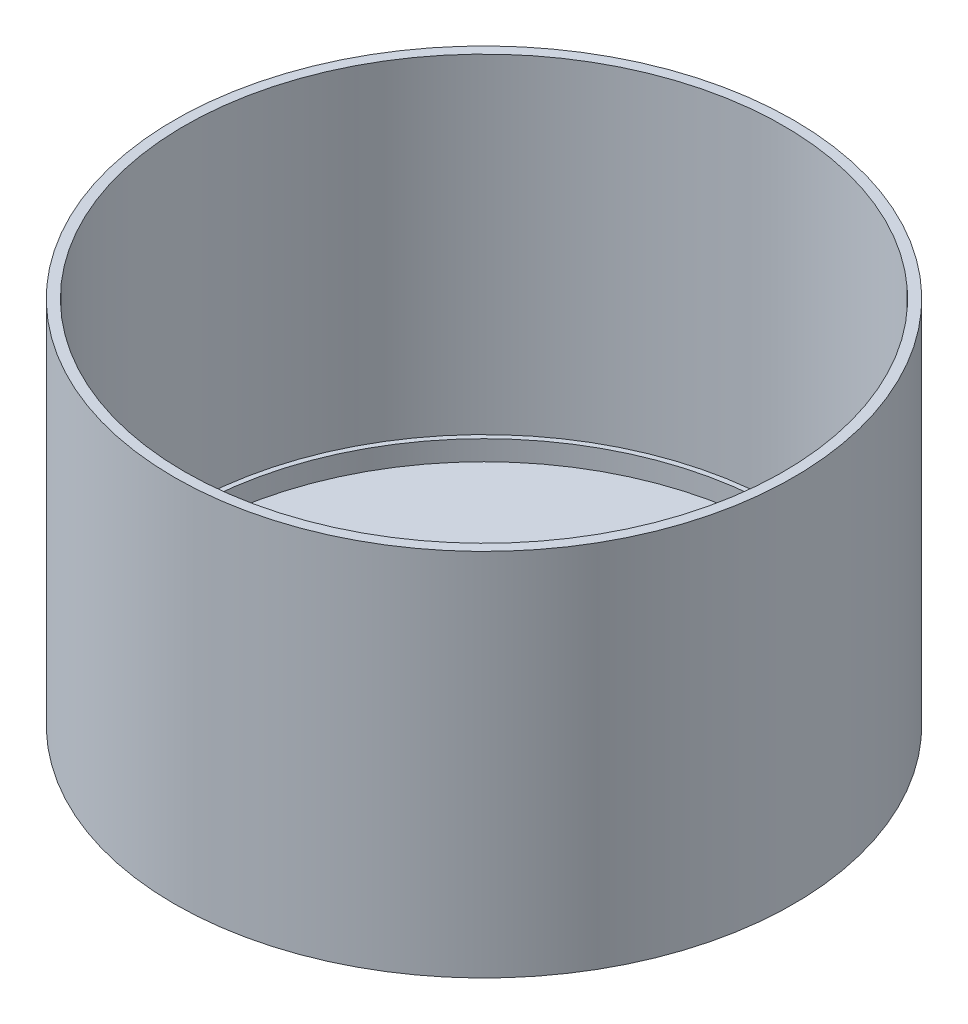
ISO-10303-21;
HEADER;
FILE_DESCRIPTION(('STEP AP214'),'2;1');
FILE_NAME('part.step','',(''),(''),'','','');
FILE_SCHEMA(('AUTOMOTIVE_DESIGN { 1 0 10303 214 1 1 1 1 }'));
ENDSEC;
DATA;
#1=APPLICATION_CONTEXT('core data for automotive mechanical design processes');
#2=APPLICATION_PROTOCOL_DEFINITION('international standard','automotive_design',2000,#1);
#3=PRODUCT_CONTEXT('',#1,'mechanical');
#4=PRODUCT('Part','Part','',(#3));
#5=PRODUCT_RELATED_PRODUCT_CATEGORY('part','',(#4));
#6=PRODUCT_DEFINITION_FORMATION('','',#4);
#7=PRODUCT_DEFINITION_CONTEXT('part definition',#1,'design');
#8=PRODUCT_DEFINITION('design','',#6,#7);
#9=PRODUCT_DEFINITION_SHAPE('','',#8);
#10=(LENGTH_UNIT() NAMED_UNIT(*) SI_UNIT(.MILLI.,.METRE.));
#11=(NAMED_UNIT(*) PLANE_ANGLE_UNIT() SI_UNIT($,.RADIAN.));
#12=(NAMED_UNIT(*) SI_UNIT($,.STERADIAN.) SOLID_ANGLE_UNIT());
#13=UNCERTAINTY_MEASURE_WITH_UNIT(LENGTH_MEASURE(1.E-05),#10,'distance_accuracy_value','');
#14=(GEOMETRIC_REPRESENTATION_CONTEXT(3) GLOBAL_UNCERTAINTY_ASSIGNED_CONTEXT((#13)) GLOBAL_UNIT_ASSIGNED_CONTEXT((#10,
#11,#12)) REPRESENTATION_CONTEXT('',''));
#15=CARTESIAN_POINT('',(0.,0.,0.));
#16=DIRECTION('',(0.,0.,1.));
#17=DIRECTION('',(1.,0.,0.));
#18=AXIS2_PLACEMENT_3D('',#15,#16,#17);
#19=CARTESIAN_POINT('',(0.,37.,0.));
#20=DIRECTION('',(0.,1.,0.));
#21=DIRECTION('',(0.,0.,1.));
#22=AXIS2_PLACEMENT_3D('',#19,#20,#21);
#23=PLANE('',#22);
#24=CARTESIAN_POINT('',(0.,37.,0.));
#25=DIRECTION('',(0.,1.,0.));
#26=DIRECTION('',(0.,0.,1.));
#27=AXIS2_PLACEMENT_3D('',#24,#25,#26);
#28=CIRCLE('',#27,31.);
#29=CARTESIAN_POINT('',(0.,37.,31.));
#30=VERTEX_POINT('',#29);
#31=EDGE_CURVE('E48',#30,#30,#28,.T.);
#32=ORIENTED_EDGE('',*,*,#31,.T.);
#33=EDGE_LOOP('',(#32));
#34=FACE_BOUND('',#33,.T.);
#35=CARTESIAN_POINT('',(0.,37.,0.));
#36=DIRECTION('',(0.,1.,0.));
#37=DIRECTION('',(0.,0.,1.));
#38=AXIS2_PLACEMENT_3D('',#35,#36,#37);
#39=CIRCLE('',#38,30.);
#40=CARTESIAN_POINT('',(0.,37.,30.));
#41=VERTEX_POINT('',#40);
#42=EDGE_CURVE('E56',#41,#41,#39,.T.);
#43=ORIENTED_EDGE('',*,*,#42,.F.);
#44=EDGE_LOOP('',(#43));
#45=FACE_BOUND('',#44,.T.);
#46=ADVANCED_FACE('F37',(#34,#45),#23,.T.);
#47=CARTESIAN_POINT('',(0.,0.,0.));
#48=DIRECTION('',(0.,1.,0.));
#49=DIRECTION('',(0.,0.,1.));
#50=AXIS2_PLACEMENT_3D('',#47,#48,#49);
#51=PLANE('',#50);
#52=CARTESIAN_POINT('',(0.,0.,0.));
#53=DIRECTION('',(0.,1.,0.));
#54=DIRECTION('',(0.,0.,1.));
#55=AXIS2_PLACEMENT_3D('',#52,#53,#54);
#56=CIRCLE('',#55,4.);
#57=CARTESIAN_POINT('',(0.,0.,4.));
#58=VERTEX_POINT('',#57);
#59=EDGE_CURVE('E63',#58,#58,#56,.T.);
#60=ORIENTED_EDGE('',*,*,#59,.T.);
#61=EDGE_LOOP('',(#60));
#62=FACE_BOUND('',#61,.T.);
#63=CARTESIAN_POINT('',(0.,0.,0.));
#64=DIRECTION('',(0.,1.,0.));
#65=DIRECTION('',(0.,0.,1.));
#66=AXIS2_PLACEMENT_3D('',#63,#64,#65);
#67=CIRCLE('',#66,31.);
#68=CARTESIAN_POINT('',(0.,0.,31.));
#69=VERTEX_POINT('',#68);
#70=EDGE_CURVE('E52',#69,#69,#67,.T.);
#71=ORIENTED_EDGE('',*,*,#70,.F.);
#72=EDGE_LOOP('',(#71));
#73=FACE_BOUND('',#72,.T.);
#74=ADVANCED_FACE('F70',(#62,#73),#51,.F.);
#75=CARTESIAN_POINT('',(0.,37.,0.));
#76=DIRECTION('',(0.,-1.,0.));
#77=DIRECTION('',(0.,0.,-1.));
#78=AXIS2_PLACEMENT_3D('',#75,#76,#77);
#79=CYLINDRICAL_SURFACE('',#78,31.);
#80=ORIENTED_EDGE('',*,*,#31,.F.);
#81=EDGE_LOOP('',(#80));
#82=FACE_BOUND('',#81,.T.);
#83=ORIENTED_EDGE('',*,*,#70,.T.);
#84=EDGE_LOOP('',(#83));
#85=FACE_BOUND('',#84,.T.);
#86=ADVANCED_FACE('F39',(#82,#85),#79,.T.);
#87=CARTESIAN_POINT('',(0.,37.,0.));
#88=DIRECTION('',(0.,-1.,0.));
#89=DIRECTION('',(0.,0.,-1.));
#90=AXIS2_PLACEMENT_3D('',#87,#88,#89);
#91=CYLINDRICAL_SURFACE('',#90,30.);
#92=CARTESIAN_POINT('',(0.,4.,0.));
#93=DIRECTION('',(0.,1.,0.));
#94=DIRECTION('',(0.,0.,1.));
#95=AXIS2_PLACEMENT_3D('',#92,#93,#94);
#96=CIRCLE('',#95,30.);
#97=CARTESIAN_POINT('',(0.,4.,30.));
#98=VERTEX_POINT('',#97);
#99=EDGE_CURVE('E10',#98,#98,#96,.T.);
#100=ORIENTED_EDGE('',*,*,#99,.F.);
#101=EDGE_LOOP('',(#100));
#102=FACE_BOUND('',#101,.T.);
#103=ORIENTED_EDGE('',*,*,#42,.T.);
#104=EDGE_LOOP('',(#103));
#105=FACE_BOUND('',#104,.T.);
#106=ADVANCED_FACE('F99',(#102,#105),#91,.F.);
#107=CARTESIAN_POINT('',(0.,4.,0.));
#108=DIRECTION('',(0.,1.,0.));
#109=DIRECTION('',(0.,0.,1.));
#110=AXIS2_PLACEMENT_3D('',#107,#108,#109);
#111=PLANE('',#110);
#112=ORIENTED_EDGE('',*,*,#99,.T.);
#113=EDGE_LOOP('',(#112));
#114=FACE_BOUND('',#113,.T.);
#115=CARTESIAN_POINT('',(0.,4.,0.));
#116=DIRECTION('',(0.,1.,0.));
#117=DIRECTION('',(0.,0.,1.));
#118=AXIS2_PLACEMENT_3D('',#115,#116,#117);
#119=CIRCLE('',#118,29.5);
#120=CARTESIAN_POINT('',(0.,4.,29.5));
#121=VERTEX_POINT('',#120);
#122=EDGE_CURVE('E60',#121,#121,#119,.T.);
#123=ORIENTED_EDGE('',*,*,#122,.F.);
#124=EDGE_LOOP('',(#123));
#125=FACE_BOUND('',#124,.T.);
#126=ADVANCED_FACE('F87',(#114,#125),#111,.T.);
#127=CARTESIAN_POINT('',(0.,4.,0.));
#128=DIRECTION('',(0.,-1.,0.));
#129=DIRECTION('',(0.,0.,-1.));
#130=AXIS2_PLACEMENT_3D('',#127,#128,#129);
#131=CYLINDRICAL_SURFACE('',#130,29.5);
#132=ORIENTED_EDGE('',*,*,#122,.T.);
#133=EDGE_LOOP('',(#132));
#134=FACE_BOUND('',#133,.T.);
#135=CARTESIAN_POINT('',(0.,2.,0.));
#136=DIRECTION('',(0.,1.,0.));
#137=DIRECTION('',(0.,0.,1.));
#138=AXIS2_PLACEMENT_3D('',#135,#136,#137);
#139=CIRCLE('',#138,29.5);
#140=CARTESIAN_POINT('',(0.,2.,29.5));
#141=VERTEX_POINT('',#140);
#142=EDGE_CURVE('E44',#141,#141,#139,.F.);
#143=ORIENTED_EDGE('',*,*,#142,.T.);
#144=EDGE_LOOP('',(#143));
#145=FACE_BOUND('',#144,.T.);
#146=ADVANCED_FACE('F82',(#134,#145),#131,.F.);
#147=CARTESIAN_POINT('',(0.,2.,0.));
#148=DIRECTION('',(0.,1.,0.));
#149=DIRECTION('',(0.,0.,1.));
#150=AXIS2_PLACEMENT_3D('',#147,#148,#149);
#151=PLANE('',#150);
#152=CARTESIAN_POINT('',(0.,2.,0.));
#153=DIRECTION('',(0.,1.,0.));
#154=DIRECTION('',(0.,0.,1.));
#155=AXIS2_PLACEMENT_3D('',#152,#153,#154);
#156=CIRCLE('',#155,4.);
#157=CARTESIAN_POINT('',(0.,2.,4.));
#158=VERTEX_POINT('',#157);
#159=EDGE_CURVE('E64',#158,#158,#156,.T.);
#160=ORIENTED_EDGE('',*,*,#159,.F.);
#161=EDGE_LOOP('',(#160));
#162=FACE_BOUND('',#161,.T.);
#163=ORIENTED_EDGE('',*,*,#142,.F.);
#164=EDGE_LOOP('',(#163));
#165=FACE_BOUND('',#164,.T.);
#166=ADVANCED_FACE('F76',(#162,#165),#151,.T.);
#167=CARTESIAN_POINT('',(0.,0.,0.));
#168=DIRECTION('',(0.,1.,0.));
#169=DIRECTION('',(0.,0.,1.));
#170=AXIS2_PLACEMENT_3D('',#167,#168,#169);
#171=CYLINDRICAL_SURFACE('',#170,4.);
#172=ORIENTED_EDGE('',*,*,#59,.F.);
#173=EDGE_LOOP('',(#172));
#174=FACE_BOUND('',#173,.T.);
#175=ORIENTED_EDGE('',*,*,#159,.T.);
#176=EDGE_LOOP('',(#175));
#177=FACE_BOUND('',#176,.T.);
#178=ADVANCED_FACE('F73',(#174,#177),#171,.F.);
#179=CLOSED_SHELL('',(#46,#74,#86,#106,#126,#146,#166,#178));
#180=MANIFOLD_SOLID_BREP('B2',#179);
#181=ADVANCED_BREP_SHAPE_REPRESENTATION('',(#18,#180),#14);
#182=SHAPE_DEFINITION_REPRESENTATION(#9,#181);
ENDSEC;
END-ISO-10303-21;
